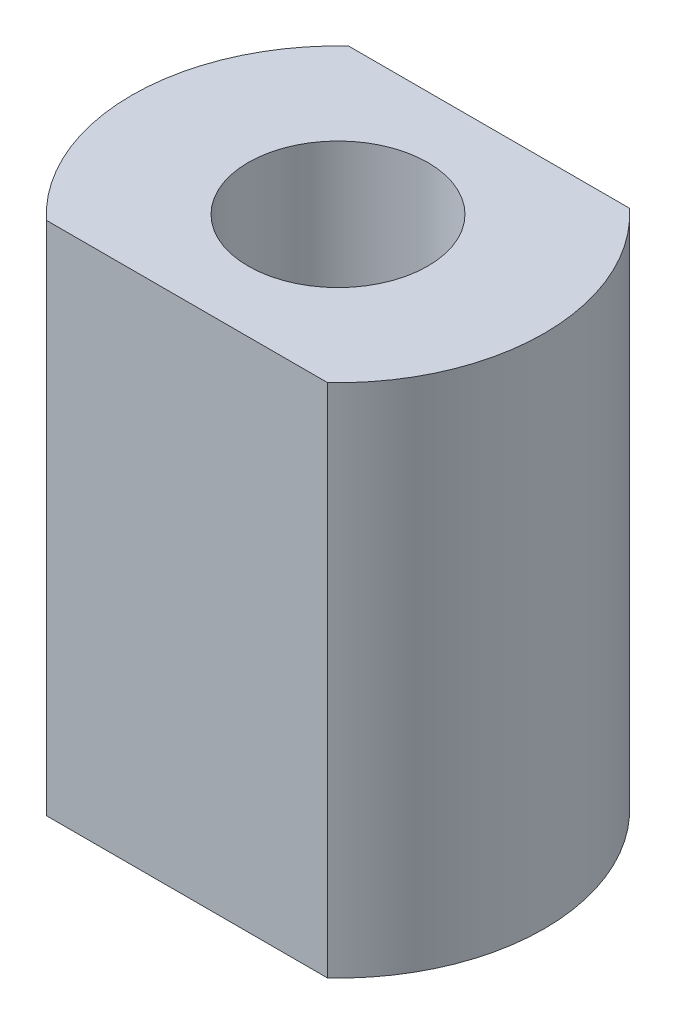
ISO-10303-21;
HEADER;
FILE_DESCRIPTION(('STEP AP214'),'2;1');
FILE_NAME('part.step','',(''),(''),'','','');
FILE_SCHEMA(('AUTOMOTIVE_DESIGN { 1 0 10303 214 1 1 1 1 }'));
ENDSEC;
DATA;
#1=APPLICATION_CONTEXT('core data for automotive mechanical design processes');
#2=APPLICATION_PROTOCOL_DEFINITION('international standard','automotive_design',2000,#1);
#3=PRODUCT_CONTEXT('',#1,'mechanical');
#4=PRODUCT('Part','Part','',(#3));
#5=PRODUCT_RELATED_PRODUCT_CATEGORY('part','',(#4));
#6=PRODUCT_DEFINITION_FORMATION('','',#4);
#7=PRODUCT_DEFINITION_CONTEXT('part definition',#1,'design');
#8=PRODUCT_DEFINITION('design','',#6,#7);
#9=PRODUCT_DEFINITION_SHAPE('','',#8);
#10=(LENGTH_UNIT() NAMED_UNIT(*) SI_UNIT(.MILLI.,.METRE.));
#11=(NAMED_UNIT(*) PLANE_ANGLE_UNIT() SI_UNIT($,.RADIAN.));
#12=(NAMED_UNIT(*) SI_UNIT($,.STERADIAN.) SOLID_ANGLE_UNIT());
#13=UNCERTAINTY_MEASURE_WITH_UNIT(LENGTH_MEASURE(1.E-05),#10,'distance_accuracy_value','');
#14=(GEOMETRIC_REPRESENTATION_CONTEXT(3) GLOBAL_UNCERTAINTY_ASSIGNED_CONTEXT((#13)) GLOBAL_UNIT_ASSIGNED_CONTEXT((#10,
#11,#12)) REPRESENTATION_CONTEXT('',''));
#15=CARTESIAN_POINT('',(0.,0.,0.));
#16=DIRECTION('',(0.,0.,1.));
#17=DIRECTION('',(1.,0.,0.));
#18=AXIS2_PLACEMENT_3D('',#15,#16,#17);
#19=CARTESIAN_POINT('',(-1.90722311227607,7.,-2.05));
#20=DIRECTION('',(0.,0.,-1.));
#21=DIRECTION('',(-1.,0.,0.));
#22=AXIS2_PLACEMENT_3D('',#19,#20,#21);
#23=PLANE('',#22);
#24=DIRECTION('',(1.,0.,0.));
#25=VECTOR('',#24,1.);
#26=CARTESIAN_POINT('',(-1.90722311227607,0.,-2.05));
#27=LINE('',#26,#25);
#28=CARTESIAN_POINT('',(-1.90722311227607,0.,-2.05));
#29=VERTEX_POINT('',#28);
#30=CARTESIAN_POINT('',(1.90722311227607,0.,-2.05));
#31=VERTEX_POINT('',#30);
#32=EDGE_CURVE('E99',#29,#31,#27,.T.);
#33=ORIENTED_EDGE('',*,*,#32,.F.);
#34=DIRECTION('',(0.,-1.,0.));
#35=VECTOR('',#34,1.);
#36=CARTESIAN_POINT('',(-1.90722311227607,7.,-2.05));
#37=LINE('',#36,#35);
#38=CARTESIAN_POINT('',(-1.90722311227607,7.,-2.05));
#39=VERTEX_POINT('',#38);
#40=EDGE_CURVE('E11',#39,#29,#37,.T.);
#41=ORIENTED_EDGE('',*,*,#40,.F.);
#42=DIRECTION('',(1.,0.,0.));
#43=VECTOR('',#42,1.);
#44=CARTESIAN_POINT('',(-1.90722311227607,7.,-2.05));
#45=LINE('',#44,#43);
#46=CARTESIAN_POINT('',(1.90722311227607,7.,-2.05));
#47=VERTEX_POINT('',#46);
#48=EDGE_CURVE('E93',#39,#47,#45,.T.);
#49=ORIENTED_EDGE('',*,*,#48,.T.);
#50=DIRECTION('',(0.,-1.,0.));
#51=VECTOR('',#50,1.);
#52=CARTESIAN_POINT('',(1.90722311227607,7.,-2.05));
#53=LINE('',#52,#51);
#54=EDGE_CURVE('E36',#47,#31,#53,.T.);
#55=ORIENTED_EDGE('',*,*,#54,.T.);
#56=EDGE_LOOP('',(#33,#41,#49,#55));
#57=FACE_BOUND('',#56,.T.);
#58=ADVANCED_FACE('F33',(#57),#23,.T.);
#59=CARTESIAN_POINT('',(0.,7.,0.));
#60=DIRECTION('',(0.,-1.,0.));
#61=DIRECTION('',(0.,0.,-1.));
#62=AXIS2_PLACEMENT_3D('',#59,#60,#61);
#63=CYLINDRICAL_SURFACE('',#62,2.8);
#64=CARTESIAN_POINT('',(0.,0.,0.));
#65=DIRECTION('',(0.,1.,0.));
#66=DIRECTION('',(0.,0.,1.));
#67=AXIS2_PLACEMENT_3D('',#64,#65,#66);
#68=CIRCLE('',#67,2.8);
#69=CARTESIAN_POINT('',(-1.90722311227607,0.,2.05));
#70=VERTEX_POINT('',#69);
#71=EDGE_CURVE('E66',#29,#70,#68,.T.);
#72=ORIENTED_EDGE('',*,*,#71,.T.);
#73=DIRECTION('',(0.,-1.,0.));
#74=VECTOR('',#73,1.);
#75=CARTESIAN_POINT('',(-1.90722311227607,7.,2.05));
#76=LINE('',#75,#74);
#77=CARTESIAN_POINT('',(-1.90722311227607,7.,2.05));
#78=VERTEX_POINT('',#77);
#79=EDGE_CURVE('E42',#78,#70,#76,.T.);
#80=ORIENTED_EDGE('',*,*,#79,.F.);
#81=CARTESIAN_POINT('',(0.,7.,0.));
#82=DIRECTION('',(0.,1.,0.));
#83=DIRECTION('',(0.,0.,1.));
#84=AXIS2_PLACEMENT_3D('',#81,#82,#83);
#85=CIRCLE('',#84,2.8);
#86=EDGE_CURVE('E81',#39,#78,#85,.T.);
#87=ORIENTED_EDGE('',*,*,#86,.F.);
#88=ORIENTED_EDGE('',*,*,#40,.T.);
#89=EDGE_LOOP('',(#72,#80,#87,#88));
#90=FACE_BOUND('',#89,.T.);
#91=ADVANCED_FACE('F110',(#90),#63,.T.);
#92=CARTESIAN_POINT('',(-1.90722311227607,7.,2.05));
#93=DIRECTION('',(0.,0.,-1.));
#94=DIRECTION('',(-1.,0.,0.));
#95=AXIS2_PLACEMENT_3D('',#92,#93,#94);
#96=PLANE('',#95);
#97=DIRECTION('',(1.,0.,0.));
#98=VECTOR('',#97,1.);
#99=CARTESIAN_POINT('',(-1.90722311227607,0.,2.05));
#100=LINE('',#99,#98);
#101=CARTESIAN_POINT('',(1.90722311227607,0.,2.05));
#102=VERTEX_POINT('',#101);
#103=EDGE_CURVE('E88',#70,#102,#100,.T.);
#104=ORIENTED_EDGE('',*,*,#103,.T.);
#105=DIRECTION('',(0.,-1.,0.));
#106=VECTOR('',#105,1.);
#107=CARTESIAN_POINT('',(1.90722311227607,7.,2.05));
#108=LINE('',#107,#106);
#109=CARTESIAN_POINT('',(1.90722311227607,7.,2.05));
#110=VERTEX_POINT('',#109);
#111=EDGE_CURVE('E85',#110,#102,#108,.T.);
#112=ORIENTED_EDGE('',*,*,#111,.F.);
#113=DIRECTION('',(1.,0.,0.));
#114=VECTOR('',#113,1.);
#115=CARTESIAN_POINT('',(-1.90722311227607,7.,2.05));
#116=LINE('',#115,#114);
#117=EDGE_CURVE('E78',#78,#110,#116,.T.);
#118=ORIENTED_EDGE('',*,*,#117,.F.);
#119=ORIENTED_EDGE('',*,*,#79,.T.);
#120=EDGE_LOOP('',(#104,#112,#118,#119));
#121=FACE_BOUND('',#120,.T.);
#122=ADVANCED_FACE('F86',(#121),#96,.F.);
#123=CARTESIAN_POINT('',(0.,7.,0.));
#124=DIRECTION('',(0.,-1.,0.));
#125=DIRECTION('',(0.,0.,-1.));
#126=AXIS2_PLACEMENT_3D('',#123,#124,#125);
#127=CYLINDRICAL_SURFACE('',#126,2.8);
#128=CARTESIAN_POINT('',(0.,0.,0.));
#129=DIRECTION('',(0.,1.,0.));
#130=DIRECTION('',(0.,0.,1.));
#131=AXIS2_PLACEMENT_3D('',#128,#129,#130);
#132=CIRCLE('',#131,2.8);
#133=EDGE_CURVE('E102',#102,#31,#132,.T.);
#134=ORIENTED_EDGE('',*,*,#133,.T.);
#135=ORIENTED_EDGE('',*,*,#54,.F.);
#136=CARTESIAN_POINT('',(0.,7.,0.));
#137=DIRECTION('',(0.,1.,0.));
#138=DIRECTION('',(0.,0.,1.));
#139=AXIS2_PLACEMENT_3D('',#136,#137,#138);
#140=CIRCLE('',#139,2.8);
#141=EDGE_CURVE('E75',#110,#47,#140,.T.);
#142=ORIENTED_EDGE('',*,*,#141,.F.);
#143=ORIENTED_EDGE('',*,*,#111,.T.);
#144=EDGE_LOOP('',(#134,#135,#142,#143));
#145=FACE_BOUND('',#144,.T.);
#146=ADVANCED_FACE('F92',(#145),#127,.T.);
#147=CARTESIAN_POINT('',(0.,7.,0.));
#148=DIRECTION('',(0.,1.,0.));
#149=DIRECTION('',(0.,0.,1.));
#150=AXIS2_PLACEMENT_3D('',#147,#148,#149);
#151=PLANE('',#150);
#152=CARTESIAN_POINT('',(0.,7.,0.));
#153=DIRECTION('',(0.,1.,0.));
#154=DIRECTION('',(0.,0.,1.));
#155=AXIS2_PLACEMENT_3D('',#152,#153,#154);
#156=CIRCLE('',#155,1.2192);
#157=CARTESIAN_POINT('',(0.,7.,1.2192));
#158=VERTEX_POINT('',#157);
#159=EDGE_CURVE('E142',#158,#158,#156,.T.);
#160=ORIENTED_EDGE('',*,*,#159,.F.);
#161=EDGE_LOOP('',(#160));
#162=FACE_BOUND('',#161,.T.);
#163=ORIENTED_EDGE('',*,*,#48,.F.);
#164=ORIENTED_EDGE('',*,*,#86,.T.);
#165=ORIENTED_EDGE('',*,*,#117,.T.);
#166=ORIENTED_EDGE('',*,*,#141,.T.);
#167=EDGE_LOOP('',(#163,#164,#165,#166));
#168=FACE_BOUND('',#167,.T.);
#169=ADVANCED_FACE('F80',(#162,#168),#151,.T.);
#170=CARTESIAN_POINT('',(0.,0.,0.));
#171=DIRECTION('',(0.,1.,0.));
#172=DIRECTION('',(0.,0.,1.));
#173=AXIS2_PLACEMENT_3D('',#170,#171,#172);
#174=PLANE('',#173);
#175=CARTESIAN_POINT('',(0.,0.,0.));
#176=DIRECTION('',(0.,1.,0.));
#177=DIRECTION('',(0.,0.,1.));
#178=AXIS2_PLACEMENT_3D('',#175,#176,#177);
#179=CIRCLE('',#178,1.2192);
#180=CARTESIAN_POINT('',(0.,0.,1.2192));
#181=VERTEX_POINT('',#180);
#182=EDGE_CURVE('E103',#181,#181,#179,.T.);
#183=ORIENTED_EDGE('',*,*,#182,.T.);
#184=EDGE_LOOP('',(#183));
#185=FACE_BOUND('',#184,.T.);
#186=ORIENTED_EDGE('',*,*,#32,.T.);
#187=ORIENTED_EDGE('',*,*,#133,.F.);
#188=ORIENTED_EDGE('',*,*,#103,.F.);
#189=ORIENTED_EDGE('',*,*,#71,.F.);
#190=EDGE_LOOP('',(#186,#187,#188,#189));
#191=FACE_BOUND('',#190,.T.);
#192=ADVANCED_FACE('F108',(#185,#191),#174,.F.);
#193=CARTESIAN_POINT('',(0.,7.,0.));
#194=DIRECTION('',(0.,1.,0.));
#195=DIRECTION('',(0.,0.,1.));
#196=AXIS2_PLACEMENT_3D('',#193,#194,#195);
#197=CYLINDRICAL_SURFACE('',#196,1.2192);
#198=ORIENTED_EDGE('',*,*,#182,.F.);
#199=EDGE_LOOP('',(#198));
#200=FACE_BOUND('',#199,.T.);
#201=ORIENTED_EDGE('',*,*,#159,.T.);
#202=EDGE_LOOP('',(#201));
#203=FACE_BOUND('',#202,.T.);
#204=ADVANCED_FACE('F129',(#200,#203),#197,.F.);
#205=CLOSED_SHELL('',(#58,#91,#122,#146,#169,#192,#204));
#206=MANIFOLD_SOLID_BREP('B2',#205);
#207=ADVANCED_BREP_SHAPE_REPRESENTATION('',(#18,#206),#14);
#208=SHAPE_DEFINITION_REPRESENTATION(#9,#207);
ENDSEC;
END-ISO-10303-21;
